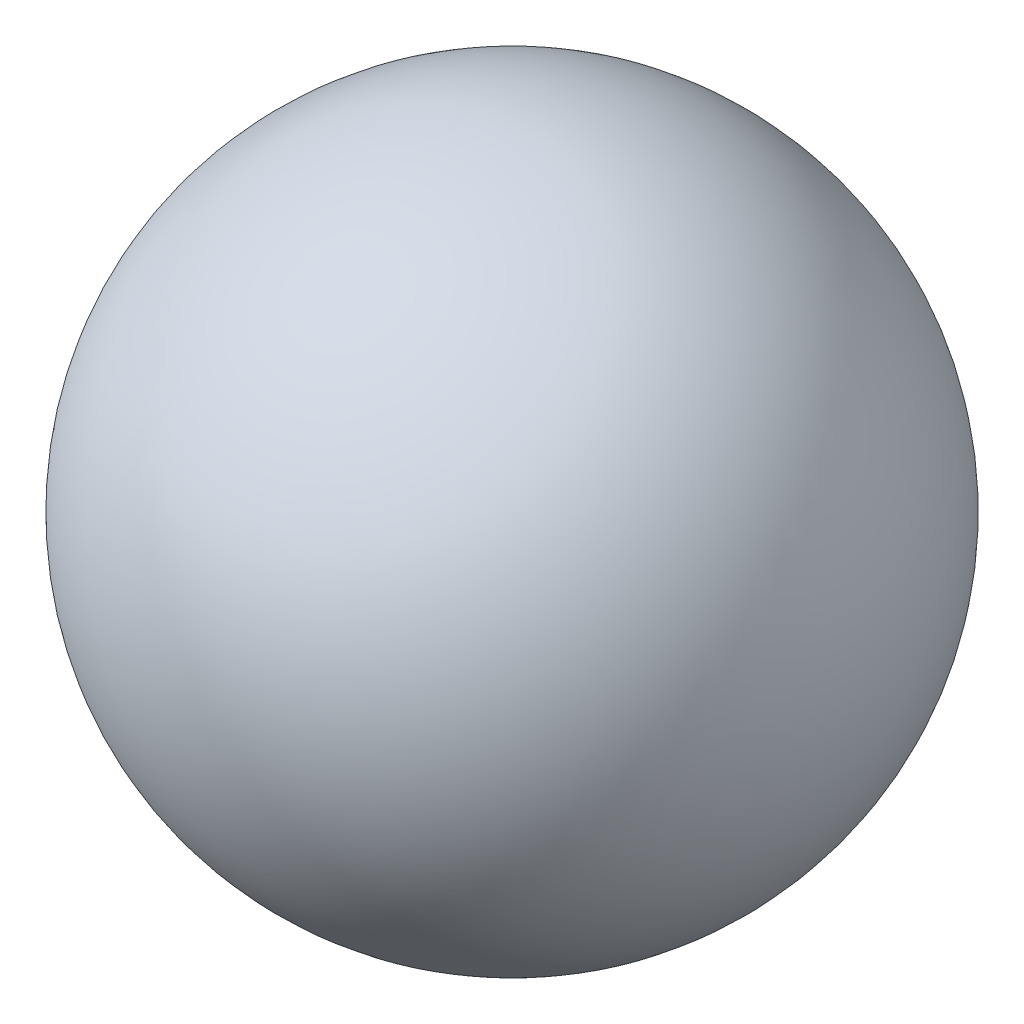
ISO-10303-21;
HEADER;
FILE_DESCRIPTION(('STEP AP214'),'2;1');
FILE_NAME('part.step','',(''),(''),'','','');
FILE_SCHEMA(('AUTOMOTIVE_DESIGN { 1 0 10303 214 1 1 1 1 }'));
ENDSEC;
DATA;
#1=APPLICATION_CONTEXT('core data for automotive mechanical design processes');
#2=APPLICATION_PROTOCOL_DEFINITION('international standard','automotive_design',2000,#1);
#3=PRODUCT_CONTEXT('',#1,'mechanical');
#4=PRODUCT('Part','Part','',(#3));
#5=PRODUCT_RELATED_PRODUCT_CATEGORY('part','',(#4));
#6=PRODUCT_DEFINITION_FORMATION('','',#4);
#7=PRODUCT_DEFINITION_CONTEXT('part definition',#1,'design');
#8=PRODUCT_DEFINITION('design','',#6,#7);
#9=PRODUCT_DEFINITION_SHAPE('','',#8);
#10=(LENGTH_UNIT() NAMED_UNIT(*) SI_UNIT(.MILLI.,.METRE.));
#11=(NAMED_UNIT(*) PLANE_ANGLE_UNIT() SI_UNIT($,.RADIAN.));
#12=(NAMED_UNIT(*) SI_UNIT($,.STERADIAN.) SOLID_ANGLE_UNIT());
#13=UNCERTAINTY_MEASURE_WITH_UNIT(LENGTH_MEASURE(1.E-05),#10,'distance_accuracy_value','');
#14=(GEOMETRIC_REPRESENTATION_CONTEXT(3) GLOBAL_UNCERTAINTY_ASSIGNED_CONTEXT((#13)) GLOBAL_UNIT_ASSIGNED_CONTEXT((#10,
#11,#12)) REPRESENTATION_CONTEXT('',''));
#15=CARTESIAN_POINT('',(0.,0.,0.));
#16=DIRECTION('',(0.,0.,1.));
#17=DIRECTION('',(1.,0.,0.));
#18=AXIS2_PLACEMENT_3D('',#15,#16,#17);
#19=CARTESIAN_POINT('',(0.,0.,0.));
#20=DIRECTION('',(0.,1.,0.));
#21=DIRECTION('',(1.,0.,0.));
#22=AXIS2_PLACEMENT_3D('',#19,#20,#21);
#23=SPHERICAL_SURFACE('',#22,5.8);
#24=CARTESIAN_POINT('',(0.,5.8,0.));
#25=VERTEX_POINT('',#24);
#26=VERTEX_LOOP('',#25);
#27=FACE_BOUND('',#26,.T.);
#28=ADVANCED_FACE('F41',(#27),#23,.T.);
#29=CLOSED_SHELL('',(#28));
#30=MANIFOLD_SOLID_BREP('B2',#29);
#31=ADVANCED_BREP_SHAPE_REPRESENTATION('',(#18,#30),#14);
#32=SHAPE_DEFINITION_REPRESENTATION(#9,#31);
ENDSEC;
END-ISO-10303-21;
